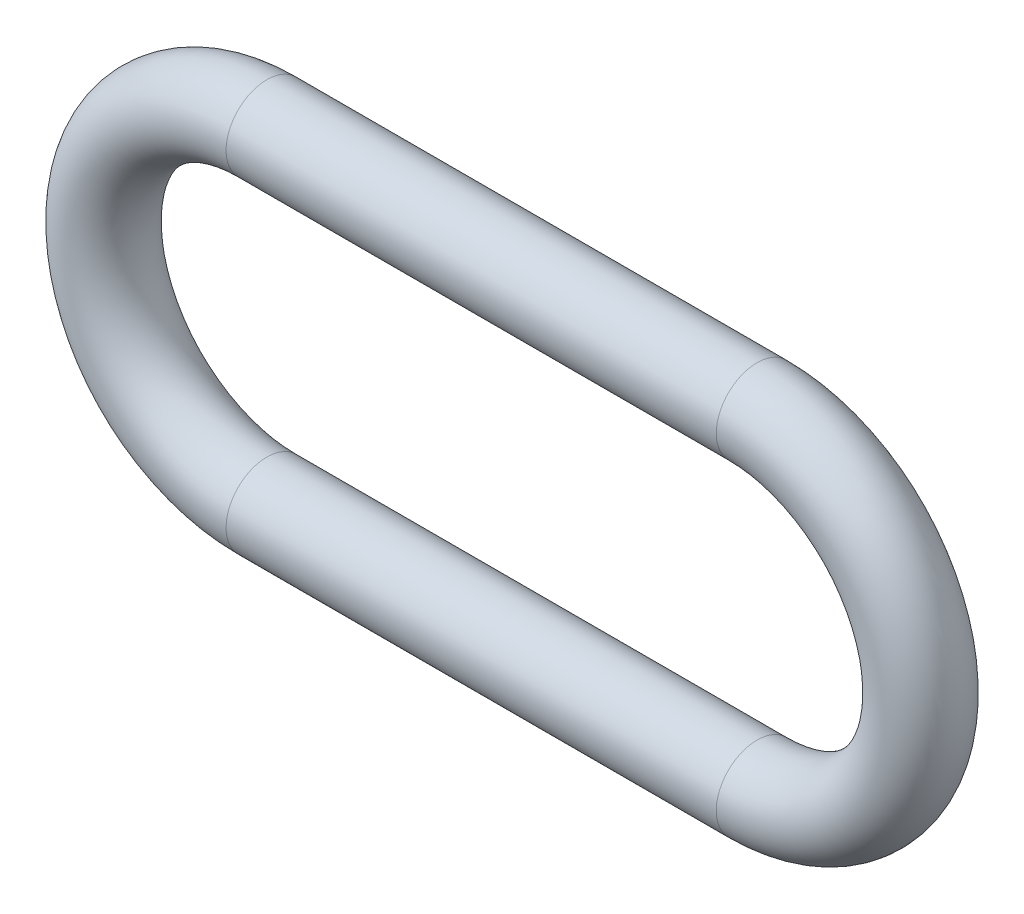
ISO-10303-21;
HEADER;
FILE_DESCRIPTION(('STEP AP214'),'2;1');
FILE_NAME('part.step','',(''),(''),'','','');
FILE_SCHEMA(('AUTOMOTIVE_DESIGN { 1 0 10303 214 1 1 1 1 }'));
ENDSEC;
DATA;
#1=APPLICATION_CONTEXT('core data for automotive mechanical design processes');
#2=APPLICATION_PROTOCOL_DEFINITION('international standard','automotive_design',2000,#1);
#3=PRODUCT_CONTEXT('',#1,'mechanical');
#4=PRODUCT('Part','Part','',(#3));
#5=PRODUCT_RELATED_PRODUCT_CATEGORY('part','',(#4));
#6=PRODUCT_DEFINITION_FORMATION('','',#4);
#7=PRODUCT_DEFINITION_CONTEXT('part definition',#1,'design');
#8=PRODUCT_DEFINITION('design','',#6,#7);
#9=PRODUCT_DEFINITION_SHAPE('','',#8);
#10=(LENGTH_UNIT() NAMED_UNIT(*) SI_UNIT(.MILLI.,.METRE.));
#11=(NAMED_UNIT(*) PLANE_ANGLE_UNIT() SI_UNIT($,.RADIAN.));
#12=(NAMED_UNIT(*) SI_UNIT($,.STERADIAN.) SOLID_ANGLE_UNIT());
#13=UNCERTAINTY_MEASURE_WITH_UNIT(LENGTH_MEASURE(1.E-05),#10,'distance_accuracy_value','');
#14=(GEOMETRIC_REPRESENTATION_CONTEXT(3) GLOBAL_UNCERTAINTY_ASSIGNED_CONTEXT((#13)) GLOBAL_UNIT_ASSIGNED_CONTEXT((#10,
#11,#12)) REPRESENTATION_CONTEXT('',''));
#15=CARTESIAN_POINT('',(0.,0.,0.));
#16=DIRECTION('',(0.,0.,1.));
#17=DIRECTION('',(1.,0.,0.));
#18=AXIS2_PLACEMENT_3D('',#15,#16,#17);
#19=CARTESIAN_POINT('',(-6.,0.,0.));
#20=DIRECTION('',(0.,0.,-1.));
#21=DIRECTION('',(-1.,0.,0.));
#22=AXIS2_PLACEMENT_3D('',#19,#20,#21);
#23=TOROIDAL_SURFACE('',#22,3.99999999999999,1.);
#24=CARTESIAN_POINT('',(-6.,-4.,0.));
#25=DIRECTION('',(1.,0.,0.));
#26=DIRECTION('',(0.,1.,0.));
#27=AXIS2_PLACEMENT_3D('',#24,#25,#26);
#28=CIRCLE('',#27,1.);
#29=CARTESIAN_POINT('',(-6.,-5.,0.));
#30=VERTEX_POINT('',#29);
#31=EDGE_CURVE('E59',#30,#30,#28,.T.);
#32=CARTESIAN_POINT('',(-6.,3.99999999999999,0.));
#33=DIRECTION('',(-1.,0.,0.));
#34=DIRECTION('',(0.,-1.,0.));
#35=AXIS2_PLACEMENT_3D('',#32,#33,#34);
#36=CIRCLE('',#35,1.);
#37=CARTESIAN_POINT('',(-6.,4.99999999999999,0.));
#38=VERTEX_POINT('',#37);
#39=EDGE_CURVE('E55',#38,#38,#36,.T.);
#40=CARTESIAN_POINT('',(-6.,0.,0.));
#41=DIRECTION('',(0.,0.,-1.));
#42=DIRECTION('',(-1.,0.,0.));
#43=AXIS2_PLACEMENT_3D('',#40,#41,#42);
#44=CIRCLE('',#43,4.99999999999999);
#45=EDGE_CURVE('',#30,#38,#44,.T.);
#46=ORIENTED_EDGE('',*,*,#31,.F.);
#47=ORIENTED_EDGE('',*,*,#39,.T.);
#48=ORIENTED_EDGE('',*,*,#45,.T.);
#49=ORIENTED_EDGE('',*,*,#45,.F.);
#50=EDGE_LOOP('',(#46,#48,#47,#49));
#51=FACE_BOUND('',#50,.T.);
#52=ADVANCED_FACE('F44',(#51),#23,.T.);
#53=CARTESIAN_POINT('',(-6.,3.99999999999999,0.));
#54=DIRECTION('',(1.,0.,0.));
#55=DIRECTION('',(0.,1.,0.));
#56=AXIS2_PLACEMENT_3D('',#53,#54,#55);
#57=CYLINDRICAL_SURFACE('',#56,1.);
#58=CARTESIAN_POINT('',(6.,4.,0.));
#59=DIRECTION('',(-1.,0.,0.));
#60=DIRECTION('',(0.,-1.,0.));
#61=AXIS2_PLACEMENT_3D('',#58,#59,#60);
#62=CIRCLE('',#61,1.);
#63=CARTESIAN_POINT('',(6.00000000000001,5.,0.));
#64=VERTEX_POINT('',#63);
#65=EDGE_CURVE('E51',#64,#64,#62,.T.);
#66=ORIENTED_EDGE('',*,*,#65,.T.);
#67=EDGE_LOOP('',(#66));
#68=FACE_BOUND('',#67,.T.);
#69=ORIENTED_EDGE('',*,*,#39,.F.);
#70=EDGE_LOOP('',(#69));
#71=FACE_BOUND('',#70,.T.);
#72=ADVANCED_FACE('F68',(#68,#71),#57,.T.);
#73=CARTESIAN_POINT('',(6.,0.,0.));
#74=DIRECTION('',(0.,0.,-1.));
#75=DIRECTION('',(-1.,0.,0.));
#76=AXIS2_PLACEMENT_3D('',#73,#74,#75);
#77=TOROIDAL_SURFACE('',#76,4.,1.);
#78=CARTESIAN_POINT('',(6.,-3.99999999999999,0.));
#79=DIRECTION('',(1.,0.,0.));
#80=DIRECTION('',(0.,1.,0.));
#81=AXIS2_PLACEMENT_3D('',#78,#79,#80);
#82=CIRCLE('',#81,1.);
#83=CARTESIAN_POINT('',(6.,-5.,0.));
#84=VERTEX_POINT('',#83);
#85=EDGE_CURVE('E11',#84,#84,#82,.T.);
#86=CARTESIAN_POINT('',(6.,0.,0.));
#87=DIRECTION('',(0.,0.,-1.));
#88=DIRECTION('',(-1.,0.,0.));
#89=AXIS2_PLACEMENT_3D('',#86,#87,#88);
#90=CIRCLE('',#89,5.);
#91=EDGE_CURVE('',#64,#84,#90,.T.);
#92=ORIENTED_EDGE('',*,*,#65,.F.);
#93=ORIENTED_EDGE('',*,*,#85,.T.);
#94=ORIENTED_EDGE('',*,*,#91,.T.);
#95=ORIENTED_EDGE('',*,*,#91,.F.);
#96=EDGE_LOOP('',(#92,#94,#93,#95));
#97=FACE_BOUND('',#96,.T.);
#98=ADVANCED_FACE('F74',(#97),#77,.T.);
#99=CARTESIAN_POINT('',(6.,-3.99999999999999,0.));
#100=DIRECTION('',(-1.,0.,0.));
#101=DIRECTION('',(0.,-1.,0.));
#102=AXIS2_PLACEMENT_3D('',#99,#100,#101);
#103=CYLINDRICAL_SURFACE('',#102,1.);
#104=ORIENTED_EDGE('',*,*,#31,.T.);
#105=EDGE_LOOP('',(#104));
#106=FACE_BOUND('',#105,.T.);
#107=ORIENTED_EDGE('',*,*,#85,.F.);
#108=EDGE_LOOP('',(#107));
#109=FACE_BOUND('',#108,.T.);
#110=ADVANCED_FACE('F46',(#106,#109),#103,.T.);
#111=CLOSED_SHELL('',(#52,#72,#98,#110));
#112=MANIFOLD_SOLID_BREP('B2',#111);
#113=ADVANCED_BREP_SHAPE_REPRESENTATION('',(#18,#112),#14);
#114=SHAPE_DEFINITION_REPRESENTATION(#9,#113);
ENDSEC;
END-ISO-10303-21;
